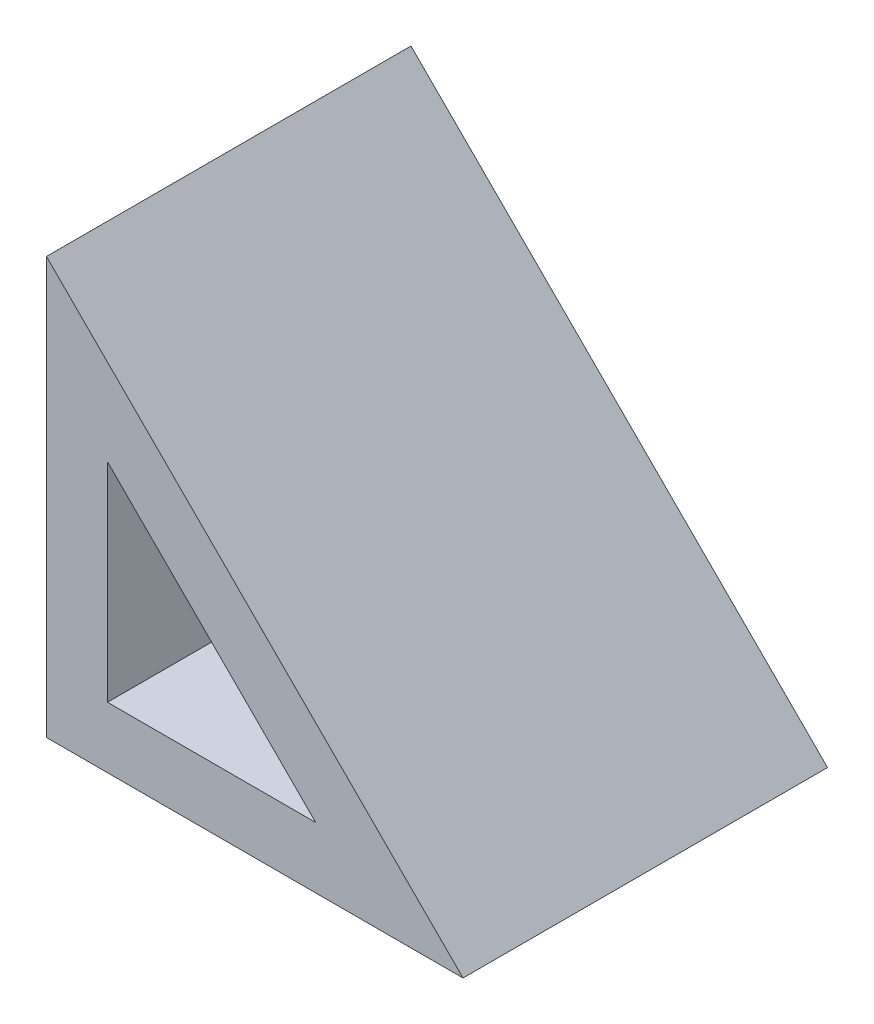
ISO-10303-21;
HEADER;
FILE_DESCRIPTION(('STEP AP214'),'2;1');
FILE_NAME('part.step','',(''),(''),'','','');
FILE_SCHEMA(('AUTOMOTIVE_DESIGN { 1 0 10303 214 1 1 1 1 }'));
ENDSEC;
DATA;
#1=APPLICATION_CONTEXT('core data for automotive mechanical design processes');
#2=APPLICATION_PROTOCOL_DEFINITION('international standard','automotive_design',2000,#1);
#3=PRODUCT_CONTEXT('',#1,'mechanical');
#4=PRODUCT('Part','Part','',(#3));
#5=PRODUCT_RELATED_PRODUCT_CATEGORY('part','',(#4));
#6=PRODUCT_DEFINITION_FORMATION('','',#4);
#7=PRODUCT_DEFINITION_CONTEXT('part definition',#1,'design');
#8=PRODUCT_DEFINITION('design','',#6,#7);
#9=PRODUCT_DEFINITION_SHAPE('','',#8);
#10=(LENGTH_UNIT() NAMED_UNIT(*) SI_UNIT(.MILLI.,.METRE.));
#11=(NAMED_UNIT(*) PLANE_ANGLE_UNIT() SI_UNIT($,.RADIAN.));
#12=(NAMED_UNIT(*) SI_UNIT($,.STERADIAN.) SOLID_ANGLE_UNIT());
#13=UNCERTAINTY_MEASURE_WITH_UNIT(LENGTH_MEASURE(1.E-05),#10,'distance_accuracy_value','');
#14=(GEOMETRIC_REPRESENTATION_CONTEXT(3) GLOBAL_UNCERTAINTY_ASSIGNED_CONTEXT((#13)) GLOBAL_UNIT_ASSIGNED_CONTEXT((#10,
#11,#12)) REPRESENTATION_CONTEXT('',''));
#15=CARTESIAN_POINT('',(0.,0.,0.));
#16=DIRECTION('',(0.,0.,1.));
#17=DIRECTION('',(1.,0.,0.));
#18=AXIS2_PLACEMENT_3D('',#15,#16,#17);
#19=CARTESIAN_POINT('',(0.,0.,22.225));
#20=DIRECTION('',(1.,0.,0.));
#21=DIRECTION('',(0.,0.,-1.));
#22=AXIS2_PLACEMENT_3D('',#19,#20,#21);
#23=PLANE('',#22);
#24=DIRECTION('',(0.,-1.,0.));
#25=VECTOR('',#24,1.);
#26=CARTESIAN_POINT('',(0.,0.,0.));
#27=LINE('',#26,#25);
#28=CARTESIAN_POINT('',(0.,25.4,0.));
#29=VERTEX_POINT('',#28);
#30=CARTESIAN_POINT('',(0.,0.,0.));
#31=VERTEX_POINT('',#30);
#32=EDGE_CURVE('E111',#29,#31,#27,.T.);
#33=ORIENTED_EDGE('',*,*,#32,.T.);
#34=DIRECTION('',(0.,0.,-1.));
#35=VECTOR('',#34,1.);
#36=CARTESIAN_POINT('',(0.,0.,22.225));
#37=LINE('',#36,#35);
#38=CARTESIAN_POINT('',(0.,0.,22.225));
#39=VERTEX_POINT('',#38);
#40=EDGE_CURVE('E11',#39,#31,#37,.T.);
#41=ORIENTED_EDGE('',*,*,#40,.F.);
#42=DIRECTION('',(0.,-1.,0.));
#43=VECTOR('',#42,1.);
#44=CARTESIAN_POINT('',(0.,0.,22.225));
#45=LINE('',#44,#43);
#46=CARTESIAN_POINT('',(0.,25.4,22.225));
#47=VERTEX_POINT('',#46);
#48=EDGE_CURVE('E113',#47,#39,#45,.T.);
#49=ORIENTED_EDGE('',*,*,#48,.F.);
#50=DIRECTION('',(0.,0.,-1.));
#51=VECTOR('',#50,1.);
#52=CARTESIAN_POINT('',(0.,25.4,22.225));
#53=LINE('',#52,#51);
#54=EDGE_CURVE('E121',#47,#29,#53,.T.);
#55=ORIENTED_EDGE('',*,*,#54,.T.);
#56=EDGE_LOOP('',(#33,#41,#49,#55));
#57=FACE_BOUND('',#56,.T.);
#58=ADVANCED_FACE('F33',(#57),#23,.F.);
#59=CARTESIAN_POINT('',(0.,0.,22.225));
#60=DIRECTION('',(0.,1.,0.));
#61=DIRECTION('',(0.,0.,1.));
#62=AXIS2_PLACEMENT_3D('',#59,#60,#61);
#63=PLANE('',#62);
#64=DIRECTION('',(1.,0.,0.));
#65=VECTOR('',#64,1.);
#66=CARTESIAN_POINT('',(0.,0.,0.));
#67=LINE('',#66,#65);
#68=CARTESIAN_POINT('',(25.4,0.,0.));
#69=VERTEX_POINT('',#68);
#70=EDGE_CURVE('E124',#31,#69,#67,.T.);
#71=ORIENTED_EDGE('',*,*,#70,.T.);
#72=DIRECTION('',(0.,0.,-1.));
#73=VECTOR('',#72,1.);
#74=CARTESIAN_POINT('',(25.4,0.,22.225));
#75=LINE('',#74,#73);
#76=CARTESIAN_POINT('',(25.4,0.,22.225));
#77=VERTEX_POINT('',#76);
#78=EDGE_CURVE('E40',#77,#69,#75,.T.);
#79=ORIENTED_EDGE('',*,*,#78,.F.);
#80=DIRECTION('',(1.,0.,0.));
#81=VECTOR('',#80,1.);
#82=CARTESIAN_POINT('',(0.,0.,22.225));
#83=LINE('',#82,#81);
#84=EDGE_CURVE('E116',#39,#77,#83,.T.);
#85=ORIENTED_EDGE('',*,*,#84,.F.);
#86=ORIENTED_EDGE('',*,*,#40,.T.);
#87=EDGE_LOOP('',(#71,#79,#85,#86));
#88=FACE_BOUND('',#87,.T.);
#89=ADVANCED_FACE('F142',(#88),#63,.F.);
#90=CARTESIAN_POINT('',(0.,25.4,22.225));
#91=DIRECTION('',(-0.707106781186547,-0.707106781186547,0.));
#92=DIRECTION('',(0.707106781186548,-0.707106781186548,0.));
#93=AXIS2_PLACEMENT_3D('',#90,#91,#92);
#94=PLANE('',#93);
#95=DIRECTION('',(-0.707106781186547,0.707106781186547,0.));
#96=VECTOR('',#95,1.);
#97=CARTESIAN_POINT('',(0.,25.4,0.));
#98=LINE('',#97,#96);
#99=EDGE_CURVE('E117',#69,#29,#98,.T.);
#100=ORIENTED_EDGE('',*,*,#99,.T.);
#101=ORIENTED_EDGE('',*,*,#54,.F.);
#102=DIRECTION('',(-0.707106781186547,0.707106781186547,0.));
#103=VECTOR('',#102,1.);
#104=CARTESIAN_POINT('',(0.,25.4,22.225));
#105=LINE('',#104,#103);
#106=EDGE_CURVE('E119',#77,#47,#105,.T.);
#107=ORIENTED_EDGE('',*,*,#106,.F.);
#108=ORIENTED_EDGE('',*,*,#78,.T.);
#109=EDGE_LOOP('',(#100,#101,#107,#108));
#110=FACE_BOUND('',#109,.T.);
#111=ADVANCED_FACE('F133',(#110),#94,.F.);
#112=CARTESIAN_POINT('',(0.,0.,22.225));
#113=DIRECTION('',(0.,0.,-1.));
#114=DIRECTION('',(-1.,0.,0.));
#115=AXIS2_PLACEMENT_3D('',#112,#113,#114);
#116=PLANE('',#115);
#117=DIRECTION('',(1.,0.,0.));
#118=VECTOR('',#117,1.);
#119=CARTESIAN_POINT('',(3.71974387893085,3.71974387893085,22.225));
#120=LINE('',#119,#118);
#121=CARTESIAN_POINT('',(3.71974387893085,3.71974387893085,22.225));
#122=VERTEX_POINT('',#121);
#123=CARTESIAN_POINT('',(16.4197438789308,3.71974387893085,22.225));
#124=VERTEX_POINT('',#123);
#125=EDGE_CURVE('E103',#122,#124,#120,.T.);
#126=ORIENTED_EDGE('',*,*,#125,.F.);
#127=DIRECTION('',(0.,-1.,0.));
#128=VECTOR('',#127,1.);
#129=CARTESIAN_POINT('',(3.71974387893085,3.71974387893085,22.225));
#130=LINE('',#129,#128);
#131=CARTESIAN_POINT('',(3.71974387893085,16.4197438789308,22.225));
#132=VERTEX_POINT('',#131);
#133=EDGE_CURVE('E47',#132,#122,#130,.T.);
#134=ORIENTED_EDGE('',*,*,#133,.F.);
#135=DIRECTION('',(-0.707106781186547,0.707106781186547,0.));
#136=VECTOR('',#135,1.);
#137=CARTESIAN_POINT('',(3.71974387893085,16.4197438789308,22.225));
#138=LINE('',#137,#136);
#139=EDGE_CURVE('E100',#124,#132,#138,.T.);
#140=ORIENTED_EDGE('',*,*,#139,.F.);
#141=EDGE_LOOP('',(#126,#134,#140));
#142=FACE_BOUND('',#141,.T.);
#143=ORIENTED_EDGE('',*,*,#48,.T.);
#144=ORIENTED_EDGE('',*,*,#84,.T.);
#145=ORIENTED_EDGE('',*,*,#106,.T.);
#146=EDGE_LOOP('',(#143,#144,#145));
#147=FACE_BOUND('',#146,.T.);
#148=ADVANCED_FACE('F141',(#142,#147),#116,.F.);
#149=CARTESIAN_POINT('',(0.,0.,0.));
#150=DIRECTION('',(0.,0.,-1.));
#151=DIRECTION('',(-1.,0.,0.));
#152=AXIS2_PLACEMENT_3D('',#149,#150,#151);
#153=PLANE('',#152);
#154=DIRECTION('',(0.,-1.,0.));
#155=VECTOR('',#154,1.);
#156=CARTESIAN_POINT('',(3.71974387893085,3.71974387893085,0.));
#157=LINE('',#156,#155);
#158=CARTESIAN_POINT('',(3.71974387893085,16.4197438789308,0.));
#159=VERTEX_POINT('',#158);
#160=CARTESIAN_POINT('',(3.71974387893085,3.71974387893085,0.));
#161=VERTEX_POINT('',#160);
#162=EDGE_CURVE('E87',#159,#161,#157,.T.);
#163=ORIENTED_EDGE('',*,*,#162,.T.);
#164=DIRECTION('',(1.,0.,0.));
#165=VECTOR('',#164,1.);
#166=CARTESIAN_POINT('',(3.71974387893085,3.71974387893085,0.));
#167=LINE('',#166,#165);
#168=CARTESIAN_POINT('',(16.4197438789308,3.71974387893085,0.));
#169=VERTEX_POINT('',#168);
#170=EDGE_CURVE('E94',#161,#169,#167,.T.);
#171=ORIENTED_EDGE('',*,*,#170,.T.);
#172=DIRECTION('',(-0.707106781186547,0.707106781186547,0.));
#173=VECTOR('',#172,1.);
#174=CARTESIAN_POINT('',(3.71974387893085,16.4197438789308,0.));
#175=LINE('',#174,#173);
#176=EDGE_CURVE('E55',#169,#159,#175,.T.);
#177=ORIENTED_EDGE('',*,*,#176,.T.);
#178=EDGE_LOOP('',(#163,#171,#177));
#179=FACE_BOUND('',#178,.T.);
#180=ORIENTED_EDGE('',*,*,#32,.F.);
#181=ORIENTED_EDGE('',*,*,#99,.F.);
#182=ORIENTED_EDGE('',*,*,#70,.F.);
#183=EDGE_LOOP('',(#180,#181,#182));
#184=FACE_BOUND('',#183,.T.);
#185=ADVANCED_FACE('F98',(#179,#184),#153,.T.);
#186=CARTESIAN_POINT('',(3.71974387893085,3.71974387893085,0.));
#187=DIRECTION('',(-1.,0.,0.));
#188=DIRECTION('',(0.,0.,1.));
#189=AXIS2_PLACEMENT_3D('',#186,#187,#188);
#190=PLANE('',#189);
#191=ORIENTED_EDGE('',*,*,#133,.T.);
#192=DIRECTION('',(0.,0.,1.));
#193=VECTOR('',#192,1.);
#194=CARTESIAN_POINT('',(3.71974387893085,3.71974387893085,0.));
#195=LINE('',#194,#193);
#196=EDGE_CURVE('E83',#161,#122,#195,.T.);
#197=ORIENTED_EDGE('',*,*,#196,.F.);
#198=ORIENTED_EDGE('',*,*,#162,.F.);
#199=DIRECTION('',(0.,0.,1.));
#200=VECTOR('',#199,1.);
#201=CARTESIAN_POINT('',(3.71974387893085,16.4197438789308,0.));
#202=LINE('',#201,#200);
#203=EDGE_CURVE('E109',#159,#132,#202,.T.);
#204=ORIENTED_EDGE('',*,*,#203,.T.);
#205=EDGE_LOOP('',(#191,#197,#198,#204));
#206=FACE_BOUND('',#205,.T.);
#207=ADVANCED_FACE('F85',(#206),#190,.F.);
#208=CARTESIAN_POINT('',(3.71974387893085,16.4197438789308,0.));
#209=DIRECTION('',(0.707106781186547,0.707106781186547,0.));
#210=DIRECTION('',(-0.707106781186548,0.707106781186548,0.));
#211=AXIS2_PLACEMENT_3D('',#208,#209,#210);
#212=PLANE('',#211);
#213=ORIENTED_EDGE('',*,*,#139,.T.);
#214=ORIENTED_EDGE('',*,*,#203,.F.);
#215=ORIENTED_EDGE('',*,*,#176,.F.);
#216=DIRECTION('',(0.,0.,1.));
#217=VECTOR('',#216,1.);
#218=CARTESIAN_POINT('',(16.4197438789308,3.71974387893085,0.));
#219=LINE('',#218,#217);
#220=EDGE_CURVE('E91',#169,#124,#219,.T.);
#221=ORIENTED_EDGE('',*,*,#220,.T.);
#222=EDGE_LOOP('',(#213,#214,#215,#221));
#223=FACE_BOUND('',#222,.T.);
#224=ADVANCED_FACE('F157',(#223),#212,.F.);
#225=CARTESIAN_POINT('',(3.71974387893085,3.71974387893085,0.));
#226=DIRECTION('',(0.,-1.,0.));
#227=DIRECTION('',(0.,0.,-1.));
#228=AXIS2_PLACEMENT_3D('',#225,#226,#227);
#229=PLANE('',#228);
#230=ORIENTED_EDGE('',*,*,#125,.T.);
#231=ORIENTED_EDGE('',*,*,#220,.F.);
#232=ORIENTED_EDGE('',*,*,#170,.F.);
#233=ORIENTED_EDGE('',*,*,#196,.T.);
#234=EDGE_LOOP('',(#230,#231,#232,#233));
#235=FACE_BOUND('',#234,.T.);
#236=ADVANCED_FACE('F95',(#235),#229,.F.);
#237=CLOSED_SHELL('',(#58,#89,#111,#148,#185,#207,#224,#236));
#238=MANIFOLD_SOLID_BREP('B2',#237);
#239=ADVANCED_BREP_SHAPE_REPRESENTATION('',(#18,#238),#14);
#240=SHAPE_DEFINITION_REPRESENTATION(#9,#239);
ENDSEC;
END-ISO-10303-21;
